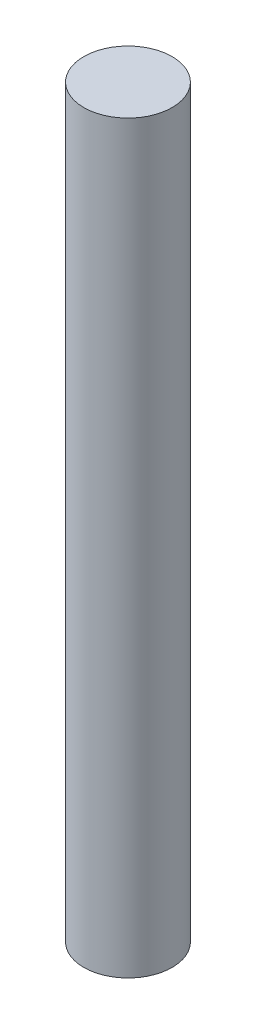
ISO-10303-21;
HEADER;
FILE_DESCRIPTION(('STEP AP214'),'2;1');
FILE_NAME('part.step','',(''),(''),'','','');
FILE_SCHEMA(('AUTOMOTIVE_DESIGN { 1 0 10303 214 1 1 1 1 }'));
ENDSEC;
DATA;
#1=APPLICATION_CONTEXT('core data for automotive mechanical design processes');
#2=APPLICATION_PROTOCOL_DEFINITION('international standard','automotive_design',2000,#1);
#3=PRODUCT_CONTEXT('',#1,'mechanical');
#4=PRODUCT('Part','Part','',(#3));
#5=PRODUCT_RELATED_PRODUCT_CATEGORY('part','',(#4));
#6=PRODUCT_DEFINITION_FORMATION('','',#4);
#7=PRODUCT_DEFINITION_CONTEXT('part definition',#1,'design');
#8=PRODUCT_DEFINITION('design','',#6,#7);
#9=PRODUCT_DEFINITION_SHAPE('','',#8);
#10=(LENGTH_UNIT() NAMED_UNIT(*) SI_UNIT(.MILLI.,.METRE.));
#11=(NAMED_UNIT(*) PLANE_ANGLE_UNIT() SI_UNIT($,.RADIAN.));
#12=(NAMED_UNIT(*) SI_UNIT($,.STERADIAN.) SOLID_ANGLE_UNIT());
#13=UNCERTAINTY_MEASURE_WITH_UNIT(LENGTH_MEASURE(1.E-05),#10,'distance_accuracy_value','');
#14=(GEOMETRIC_REPRESENTATION_CONTEXT(3) GLOBAL_UNCERTAINTY_ASSIGNED_CONTEXT((#13)) GLOBAL_UNIT_ASSIGNED_CONTEXT((#10,
#11,#12)) REPRESENTATION_CONTEXT('',''));
#15=CARTESIAN_POINT('',(0.,0.,0.));
#16=DIRECTION('',(0.,0.,1.));
#17=DIRECTION('',(1.,0.,0.));
#18=AXIS2_PLACEMENT_3D('',#15,#16,#17);
#19=CARTESIAN_POINT('',(0.,134.9,0.));
#20=DIRECTION('',(0.,-1.,0.));
#21=DIRECTION('',(0.,0.,-1.));
#22=AXIS2_PLACEMENT_3D('',#19,#20,#21);
#23=CYLINDRICAL_SURFACE('',#22,7.99999999981083);
#24=CARTESIAN_POINT('',(0.,134.9,0.));
#25=DIRECTION('',(0.,1.,0.));
#26=DIRECTION('',(0.,0.,1.));
#27=AXIS2_PLACEMENT_3D('',#24,#25,#26);
#28=CIRCLE('',#27,7.99999999981083);
#29=CARTESIAN_POINT('',(0.,134.9,7.99999999981083));
#30=VERTEX_POINT('',#29);
#31=EDGE_CURVE('E12',#30,#30,#28,.T.);
#32=ORIENTED_EDGE('',*,*,#31,.F.);
#33=EDGE_LOOP('',(#32));
#34=FACE_BOUND('',#33,.T.);
#35=CARTESIAN_POINT('',(0.,0.,0.));
#36=DIRECTION('',(0.,1.,0.));
#37=DIRECTION('',(0.,0.,1.));
#38=AXIS2_PLACEMENT_3D('',#35,#36,#37);
#39=CIRCLE('',#38,7.99999999981083);
#40=CARTESIAN_POINT('',(0.,0.,7.99999999981083));
#41=VERTEX_POINT('',#40);
#42=EDGE_CURVE('E46',#41,#41,#39,.T.);
#43=ORIENTED_EDGE('',*,*,#42,.T.);
#44=EDGE_LOOP('',(#43));
#45=FACE_BOUND('',#44,.T.);
#46=ADVANCED_FACE('F43',(#34,#45),#23,.T.);
#47=CARTESIAN_POINT('',(0.,134.9,0.));
#48=DIRECTION('',(0.,1.,0.));
#49=DIRECTION('',(0.,0.,1.));
#50=AXIS2_PLACEMENT_3D('',#47,#48,#49);
#51=PLANE('',#50);
#52=ORIENTED_EDGE('',*,*,#31,.T.);
#53=EDGE_LOOP('',(#52));
#54=FACE_BOUND('',#53,.T.);
#55=ADVANCED_FACE('F58',(#54),#51,.T.);
#56=CARTESIAN_POINT('',(0.,0.,0.));
#57=DIRECTION('',(0.,1.,0.));
#58=DIRECTION('',(0.,0.,1.));
#59=AXIS2_PLACEMENT_3D('',#56,#57,#58);
#60=PLANE('',#59);
#61=ORIENTED_EDGE('',*,*,#42,.F.);
#62=EDGE_LOOP('',(#61));
#63=FACE_BOUND('',#62,.T.);
#64=ADVANCED_FACE('F56',(#63),#60,.F.);
#65=CLOSED_SHELL('',(#46,#55,#64));
#66=MANIFOLD_SOLID_BREP('B2',#65);
#67=ADVANCED_BREP_SHAPE_REPRESENTATION('',(#18,#66),#14);
#68=SHAPE_DEFINITION_REPRESENTATION(#9,#67);
ENDSEC;
END-ISO-10303-21;
